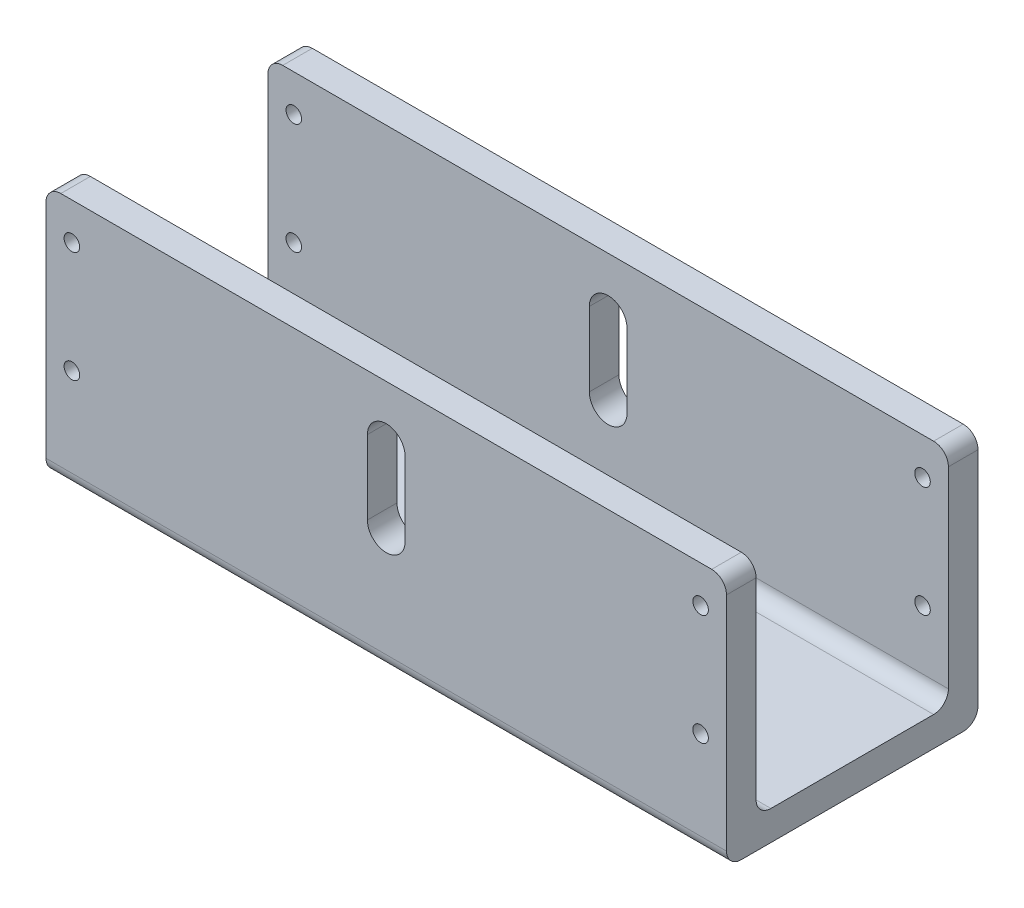
ISO-10303-21;
HEADER;
FILE_DESCRIPTION(('STEP AP214'),'2;1');
FILE_NAME('part.step','',(''),(''),'','','');
FILE_SCHEMA(('AUTOMOTIVE_DESIGN { 1 0 10303 214 1 1 1 1 }'));
ENDSEC;
DATA;
#1=APPLICATION_CONTEXT('core data for automotive mechanical design processes');
#2=APPLICATION_PROTOCOL_DEFINITION('international standard','automotive_design',2000,#1);
#3=PRODUCT_CONTEXT('',#1,'mechanical');
#4=PRODUCT('Part','Part','',(#3));
#5=PRODUCT_RELATED_PRODUCT_CATEGORY('part','',(#4));
#6=PRODUCT_DEFINITION_FORMATION('','',#4);
#7=PRODUCT_DEFINITION_CONTEXT('part definition',#1,'design');
#8=PRODUCT_DEFINITION('design','',#6,#7);
#9=PRODUCT_DEFINITION_SHAPE('','',#8);
#10=(LENGTH_UNIT() NAMED_UNIT(*) SI_UNIT(.MILLI.,.METRE.));
#11=(NAMED_UNIT(*) PLANE_ANGLE_UNIT() SI_UNIT($,.RADIAN.));
#12=(NAMED_UNIT(*) SI_UNIT($,.STERADIAN.) SOLID_ANGLE_UNIT());
#13=UNCERTAINTY_MEASURE_WITH_UNIT(LENGTH_MEASURE(1.E-05),#10,'distance_accuracy_value','');
#14=(GEOMETRIC_REPRESENTATION_CONTEXT(3) GLOBAL_UNCERTAINTY_ASSIGNED_CONTEXT((#13)) GLOBAL_UNIT_ASSIGNED_CONTEXT((#10,
#11,#12)) REPRESENTATION_CONTEXT('',''));
#15=CARTESIAN_POINT('',(0.,0.,0.));
#16=DIRECTION('',(0.,0.,1.));
#17=DIRECTION('',(1.,0.,0.));
#18=AXIS2_PLACEMENT_3D('',#15,#16,#17);
#19=CARTESIAN_POINT('',(0.,0.,4.));
#20=DIRECTION('',(0.,0.,1.));
#21=DIRECTION('',(1.,0.,0.));
#22=AXIS2_PLACEMENT_3D('',#19,#20,#21);
#23=PLANE('',#22);
#24=CARTESIAN_POINT('',(88.5,-5.,4.));
#25=DIRECTION('',(0.,0.,1.));
#26=DIRECTION('',(1.,0.,0.));
#27=AXIS2_PLACEMENT_3D('',#24,#25,#26);
#28=CIRCLE('',#27,1.05);
#29=CARTESIAN_POINT('',(89.55,-5.,4.));
#30=VERTEX_POINT('',#29);
#31=EDGE_CURVE('E357',#30,#30,#28,.T.);
#32=ORIENTED_EDGE('',*,*,#31,.F.);
#33=EDGE_LOOP('',(#32));
#34=FACE_BOUND('',#33,.T.);
#35=CARTESIAN_POINT('',(3.5,-5.,4.));
#36=DIRECTION('',(0.,0.,1.));
#37=DIRECTION('',(1.,0.,0.));
#38=AXIS2_PLACEMENT_3D('',#35,#36,#37);
#39=CIRCLE('',#38,1.05);
#40=CARTESIAN_POINT('',(4.55,-5.,4.));
#41=VERTEX_POINT('',#40);
#42=EDGE_CURVE('E375',#41,#41,#39,.T.);
#43=ORIENTED_EDGE('',*,*,#42,.F.);
#44=EDGE_LOOP('',(#43));
#45=FACE_BOUND('',#44,.T.);
#46=DIRECTION('',(0.,-1.,0.));
#47=VECTOR('',#46,1.);
#48=CARTESIAN_POINT('',(0.,0.,4.));
#49=LINE('',#48,#47);
#50=CARTESIAN_POINT('',(0.,-2.,4.));
#51=VERTEX_POINT('',#50);
#52=CARTESIAN_POINT('',(0.,-28.,4.));
#53=VERTEX_POINT('',#52);
#54=EDGE_CURVE('E376',#51,#53,#49,.T.);
#55=ORIENTED_EDGE('',*,*,#54,.T.);
#56=DIRECTION('',(1.,0.,0.));
#57=VECTOR('',#56,1.);
#58=CARTESIAN_POINT('',(92.,-28.,4.));
#59=LINE('',#58,#57);
#60=CARTESIAN_POINT('',(92.,-28.,4.));
#61=VERTEX_POINT('',#60);
#62=EDGE_CURVE('E468',#53,#61,#59,.T.);
#63=ORIENTED_EDGE('',*,*,#62,.T.);
#64=DIRECTION('',(0.,1.,0.));
#65=VECTOR('',#64,1.);
#66=CARTESIAN_POINT('',(92.,0.,4.));
#67=LINE('',#66,#65);
#68=CARTESIAN_POINT('',(92.,-2.,4.));
#69=VERTEX_POINT('',#68);
#70=EDGE_CURVE('E384',#61,#69,#67,.T.);
#71=ORIENTED_EDGE('',*,*,#70,.T.);
#72=CARTESIAN_POINT('',(90.,-2.,4.));
#73=DIRECTION('',(0.,0.,1.));
#74=DIRECTION('',(1.,0.,0.));
#75=AXIS2_PLACEMENT_3D('',#72,#73,#74);
#76=CIRCLE('',#75,2.);
#77=CARTESIAN_POINT('',(90.,0.,4.));
#78=VERTEX_POINT('',#77);
#79=EDGE_CURVE('E464',#69,#78,#76,.T.);
#80=ORIENTED_EDGE('',*,*,#79,.T.);
#81=DIRECTION('',(-1.,0.,0.));
#82=VECTOR('',#81,1.);
#83=CARTESIAN_POINT('',(0.,0.,4.));
#84=LINE('',#83,#82);
#85=CARTESIAN_POINT('',(2.,0.,4.));
#86=VERTEX_POINT('',#85);
#87=EDGE_CURVE('E388',#78,#86,#84,.T.);
#88=ORIENTED_EDGE('',*,*,#87,.T.);
#89=CARTESIAN_POINT('',(2.,-2.,4.));
#90=DIRECTION('',(0.,0.,1.));
#91=DIRECTION('',(1.,0.,0.));
#92=AXIS2_PLACEMENT_3D('',#89,#90,#91);
#93=CIRCLE('',#92,2.);
#94=EDGE_CURVE('E465',#86,#51,#93,.T.);
#95=ORIENTED_EDGE('',*,*,#94,.T.);
#96=EDGE_LOOP('',(#55,#63,#71,#80,#88,#95));
#97=FACE_BOUND('',#96,.T.);
#98=CARTESIAN_POINT('',(3.5,-20.,4.));
#99=DIRECTION('',(0.,0.,1.));
#100=DIRECTION('',(1.,0.,0.));
#101=AXIS2_PLACEMENT_3D('',#98,#99,#100);
#102=CIRCLE('',#101,1.05);
#103=CARTESIAN_POINT('',(4.55,-20.,4.));
#104=VERTEX_POINT('',#103);
#105=EDGE_CURVE('E363',#104,#104,#102,.T.);
#106=ORIENTED_EDGE('',*,*,#105,.F.);
#107=EDGE_LOOP('',(#106));
#108=FACE_BOUND('',#107,.T.);
#109=CARTESIAN_POINT('',(88.5,-20.,4.));
#110=DIRECTION('',(0.,0.,1.));
#111=DIRECTION('',(1.,0.,0.));
#112=AXIS2_PLACEMENT_3D('',#109,#110,#111);
#113=CIRCLE('',#112,1.04999999999999);
#114=CARTESIAN_POINT('',(89.55,-20.,4.));
#115=VERTEX_POINT('',#114);
#116=EDGE_CURVE('E348',#115,#115,#113,.T.);
#117=ORIENTED_EDGE('',*,*,#116,.F.);
#118=EDGE_LOOP('',(#117));
#119=FACE_BOUND('',#118,.T.);
#120=DIRECTION('',(0.,1.,0.));
#121=VECTOR('',#120,1.);
#122=CARTESIAN_POINT('',(48.55,-17.5,4.));
#123=LINE('',#122,#121);
#124=CARTESIAN_POINT('',(48.55,-17.5,4.));
#125=VERTEX_POINT('',#124);
#126=CARTESIAN_POINT('',(48.55,-7.5,4.));
#127=VERTEX_POINT('',#126);
#128=EDGE_CURVE('E306',#125,#127,#123,.T.);
#129=ORIENTED_EDGE('',*,*,#128,.F.);
#130=CARTESIAN_POINT('',(46.,-17.5,4.));
#131=DIRECTION('',(0.,0.,1.));
#132=DIRECTION('',(1.,0.,0.));
#133=AXIS2_PLACEMENT_3D('',#130,#131,#132);
#134=CIRCLE('',#133,2.55);
#135=CARTESIAN_POINT('',(43.45,-17.5,4.));
#136=VERTEX_POINT('',#135);
#137=EDGE_CURVE('E301',#136,#125,#134,.T.);
#138=ORIENTED_EDGE('',*,*,#137,.F.);
#139=DIRECTION('',(0.,-1.,0.));
#140=VECTOR('',#139,1.);
#141=CARTESIAN_POINT('',(43.45,-17.5,4.));
#142=LINE('',#141,#140);
#143=CARTESIAN_POINT('',(43.45,-7.5,4.));
#144=VERTEX_POINT('',#143);
#145=EDGE_CURVE('E316',#144,#136,#142,.T.);
#146=ORIENTED_EDGE('',*,*,#145,.F.);
#147=CARTESIAN_POINT('',(46.,-7.5,4.));
#148=DIRECTION('',(0.,0.,1.));
#149=DIRECTION('',(1.,0.,0.));
#150=AXIS2_PLACEMENT_3D('',#147,#148,#149);
#151=CIRCLE('',#150,2.55);
#152=EDGE_CURVE('E315',#127,#144,#151,.T.);
#153=ORIENTED_EDGE('',*,*,#152,.F.);
#154=EDGE_LOOP('',(#129,#138,#146,#153));
#155=FACE_BOUND('',#154,.T.);
#156=ADVANCED_FACE('F44',(#34,#45,#97,#108,#119,#155),#23,.T.);
#157=CARTESIAN_POINT('',(0.,0.,0.));
#158=DIRECTION('',(0.,0.,1.));
#159=DIRECTION('',(1.,0.,0.));
#160=AXIS2_PLACEMENT_3D('',#157,#158,#159);
#161=PLANE('',#160);
#162=CARTESIAN_POINT('',(88.5,-20.,0.));
#163=DIRECTION('',(0.,0.,1.));
#164=DIRECTION('',(1.,0.,0.));
#165=AXIS2_PLACEMENT_3D('',#162,#163,#164);
#166=CIRCLE('',#165,1.04999999999999);
#167=CARTESIAN_POINT('',(89.55,-20.,0.));
#168=VERTEX_POINT('',#167);
#169=EDGE_CURVE('E350',#168,#168,#166,.T.);
#170=ORIENTED_EDGE('',*,*,#169,.T.);
#171=EDGE_LOOP('',(#170));
#172=FACE_BOUND('',#171,.T.);
#173=CARTESIAN_POINT('',(88.5,-5.,0.));
#174=DIRECTION('',(0.,0.,1.));
#175=DIRECTION('',(1.,0.,0.));
#176=AXIS2_PLACEMENT_3D('',#173,#174,#175);
#177=CIRCLE('',#176,1.05);
#178=CARTESIAN_POINT('',(89.55,-5.,0.));
#179=VERTEX_POINT('',#178);
#180=EDGE_CURVE('E355',#179,#179,#177,.T.);
#181=ORIENTED_EDGE('',*,*,#180,.T.);
#182=EDGE_LOOP('',(#181));
#183=FACE_BOUND('',#182,.T.);
#184=CARTESIAN_POINT('',(3.5,-20.,0.));
#185=DIRECTION('',(0.,0.,1.));
#186=DIRECTION('',(1.,0.,0.));
#187=AXIS2_PLACEMENT_3D('',#184,#185,#186);
#188=CIRCLE('',#187,1.05);
#189=CARTESIAN_POINT('',(4.55,-20.,0.));
#190=VERTEX_POINT('',#189);
#191=EDGE_CURVE('E358',#190,#190,#188,.T.);
#192=ORIENTED_EDGE('',*,*,#191,.T.);
#193=EDGE_LOOP('',(#192));
#194=FACE_BOUND('',#193,.T.);
#195=CARTESIAN_POINT('',(3.5,-5.,0.));
#196=DIRECTION('',(0.,0.,1.));
#197=DIRECTION('',(1.,0.,0.));
#198=AXIS2_PLACEMENT_3D('',#195,#196,#197);
#199=CIRCLE('',#198,1.05);
#200=CARTESIAN_POINT('',(4.55,-5.,0.));
#201=VERTEX_POINT('',#200);
#202=EDGE_CURVE('E368',#201,#201,#199,.T.);
#203=ORIENTED_EDGE('',*,*,#202,.T.);
#204=EDGE_LOOP('',(#203));
#205=FACE_BOUND('',#204,.T.);
#206=DIRECTION('',(-1.,0.,0.));
#207=VECTOR('',#206,1.);
#208=CARTESIAN_POINT('',(0.,0.,0.));
#209=LINE('',#208,#207);
#210=CARTESIAN_POINT('',(90.,0.,0.));
#211=VERTEX_POINT('',#210);
#212=CARTESIAN_POINT('',(2.,0.,0.));
#213=VERTEX_POINT('',#212);
#214=EDGE_CURVE('E383',#211,#213,#209,.T.);
#215=ORIENTED_EDGE('',*,*,#214,.F.);
#216=CARTESIAN_POINT('',(90.,-2.,0.));
#217=DIRECTION('',(0.,0.,1.));
#218=DIRECTION('',(1.,0.,0.));
#219=AXIS2_PLACEMENT_3D('',#216,#217,#218);
#220=CIRCLE('',#219,2.);
#221=CARTESIAN_POINT('',(92.,-2.,0.));
#222=VERTEX_POINT('',#221);
#223=EDGE_CURVE('E495',#211,#222,#220,.F.);
#224=ORIENTED_EDGE('',*,*,#223,.T.);
#225=DIRECTION('',(0.,1.,0.));
#226=VECTOR('',#225,1.);
#227=CARTESIAN_POINT('',(92.,0.,0.));
#228=LINE('',#227,#226);
#229=CARTESIAN_POINT('',(92.,-32.,0.));
#230=VERTEX_POINT('',#229);
#231=EDGE_CURVE('E400',#230,#222,#228,.T.);
#232=ORIENTED_EDGE('',*,*,#231,.F.);
#233=DIRECTION('',(1.,0.,0.));
#234=VECTOR('',#233,1.);
#235=CARTESIAN_POINT('',(0.,-32.,0.));
#236=LINE('',#235,#234);
#237=CARTESIAN_POINT('',(0.,-32.,0.));
#238=VERTEX_POINT('',#237);
#239=EDGE_CURVE('E488',#230,#238,#236,.F.);
#240=ORIENTED_EDGE('',*,*,#239,.T.);
#241=DIRECTION('',(0.,-1.,0.));
#242=VECTOR('',#241,1.);
#243=CARTESIAN_POINT('',(0.,0.,0.));
#244=LINE('',#243,#242);
#245=CARTESIAN_POINT('',(0.,-2.,0.));
#246=VERTEX_POINT('',#245);
#247=EDGE_CURVE('E377',#246,#238,#244,.T.);
#248=ORIENTED_EDGE('',*,*,#247,.F.);
#249=CARTESIAN_POINT('',(2.,-2.,0.));
#250=DIRECTION('',(0.,0.,1.));
#251=DIRECTION('',(1.,0.,0.));
#252=AXIS2_PLACEMENT_3D('',#249,#250,#251);
#253=CIRCLE('',#252,2.);
#254=EDGE_CURVE('E489',#246,#213,#253,.F.);
#255=ORIENTED_EDGE('',*,*,#254,.T.);
#256=EDGE_LOOP('',(#215,#224,#232,#240,#248,#255));
#257=FACE_BOUND('',#256,.T.);
#258=CARTESIAN_POINT('',(46.,-17.5,0.));
#259=DIRECTION('',(0.,0.,1.));
#260=DIRECTION('',(1.,0.,0.));
#261=AXIS2_PLACEMENT_3D('',#258,#259,#260);
#262=CIRCLE('',#261,2.55);
#263=CARTESIAN_POINT('',(43.45,-17.5,0.));
#264=VERTEX_POINT('',#263);
#265=CARTESIAN_POINT('',(48.55,-17.5,0.));
#266=VERTEX_POINT('',#265);
#267=EDGE_CURVE('E296',#264,#266,#262,.T.);
#268=ORIENTED_EDGE('',*,*,#267,.T.);
#269=DIRECTION('',(0.,1.,0.));
#270=VECTOR('',#269,1.);
#271=CARTESIAN_POINT('',(48.55,-17.5,0.));
#272=LINE('',#271,#270);
#273=CARTESIAN_POINT('',(48.55,-7.5,0.));
#274=VERTEX_POINT('',#273);
#275=EDGE_CURVE('E321',#266,#274,#272,.T.);
#276=ORIENTED_EDGE('',*,*,#275,.T.);
#277=CARTESIAN_POINT('',(46.,-7.5,0.));
#278=DIRECTION('',(0.,0.,1.));
#279=DIRECTION('',(1.,0.,0.));
#280=AXIS2_PLACEMENT_3D('',#277,#278,#279);
#281=CIRCLE('',#280,2.55);
#282=CARTESIAN_POINT('',(43.45,-7.5,0.));
#283=VERTEX_POINT('',#282);
#284=EDGE_CURVE('E330',#274,#283,#281,.T.);
#285=ORIENTED_EDGE('',*,*,#284,.T.);
#286=DIRECTION('',(0.,-1.,0.));
#287=VECTOR('',#286,1.);
#288=CARTESIAN_POINT('',(43.45,-17.5,0.));
#289=LINE('',#288,#287);
#290=EDGE_CURVE('E309',#283,#264,#289,.T.);
#291=ORIENTED_EDGE('',*,*,#290,.T.);
#292=EDGE_LOOP('',(#268,#276,#285,#291));
#293=FACE_BOUND('',#292,.T.);
#294=ADVANCED_FACE('F599',(#172,#183,#194,#205,#257,#293),#161,.F.);
#295=CARTESIAN_POINT('',(0.,0.,4.));
#296=DIRECTION('',(1.,0.,0.));
#297=DIRECTION('',(0.,1.,0.));
#298=AXIS2_PLACEMENT_3D('',#295,#296,#297);
#299=PLANE('',#298);
#300=DIRECTION('',(0.,0.,-1.));
#301=VECTOR('',#300,1.);
#302=CARTESIAN_POINT('',(0.,-34.,0.));
#303=LINE('',#302,#301);
#304=CARTESIAN_POINT('',(0.,-34.,32.));
#305=VERTEX_POINT('',#304);
#306=CARTESIAN_POINT('',(0.,-34.,2.));
#307=VERTEX_POINT('',#306);
#308=EDGE_CURVE('E288',#305,#307,#303,.T.);
#309=ORIENTED_EDGE('',*,*,#308,.F.);
#310=CARTESIAN_POINT('',(0.,-32.,32.));
#311=DIRECTION('',(1.,0.,0.));
#312=DIRECTION('',(0.,1.,0.));
#313=AXIS2_PLACEMENT_3D('',#310,#311,#312);
#314=CIRCLE('',#313,2.);
#315=CARTESIAN_POINT('',(0.,-32.,34.));
#316=VERTEX_POINT('',#315);
#317=EDGE_CURVE('E443',#305,#316,#314,.F.);
#318=ORIENTED_EDGE('',*,*,#317,.T.);
#319=DIRECTION('',(0.,-1.,0.));
#320=VECTOR('',#319,1.);
#321=CARTESIAN_POINT('',(0.,-34.,34.));
#322=LINE('',#321,#320);
#323=CARTESIAN_POINT('',(0.,-2.,34.));
#324=VERTEX_POINT('',#323);
#325=EDGE_CURVE('E262',#324,#316,#322,.T.);
#326=ORIENTED_EDGE('',*,*,#325,.F.);
#327=DIRECTION('',(0.,0.,-1.));
#328=VECTOR('',#327,1.);
#329=CARTESIAN_POINT('',(0.,-2.,4.));
#330=LINE('',#329,#328);
#331=CARTESIAN_POINT('',(0.,-2.,30.));
#332=VERTEX_POINT('',#331);
#333=EDGE_CURVE('E438',#324,#332,#330,.T.);
#334=ORIENTED_EDGE('',*,*,#333,.T.);
#335=DIRECTION('',(0.,-1.,0.));
#336=VECTOR('',#335,1.);
#337=CARTESIAN_POINT('',(0.,-34.,30.));
#338=LINE('',#337,#336);
#339=CARTESIAN_POINT('',(0.,-28.,30.));
#340=VERTEX_POINT('',#339);
#341=EDGE_CURVE('E263',#332,#340,#338,.T.);
#342=ORIENTED_EDGE('',*,*,#341,.T.);
#343=CARTESIAN_POINT('',(0.,-28.,28.));
#344=DIRECTION('',(1.,0.,0.));
#345=DIRECTION('',(0.,1.,0.));
#346=AXIS2_PLACEMENT_3D('',#343,#344,#345);
#347=CIRCLE('',#346,2.);
#348=CARTESIAN_POINT('',(0.,-30.,28.));
#349=VERTEX_POINT('',#348);
#350=EDGE_CURVE('E494',#340,#349,#347,.T.);
#351=ORIENTED_EDGE('',*,*,#350,.T.);
#352=DIRECTION('',(0.,0.,-1.));
#353=VECTOR('',#352,1.);
#354=CARTESIAN_POINT('',(0.,-30.,0.));
#355=LINE('',#354,#353);
#356=CARTESIAN_POINT('',(0.,-30.,6.));
#357=VERTEX_POINT('',#356);
#358=EDGE_CURVE('E277',#349,#357,#355,.T.);
#359=ORIENTED_EDGE('',*,*,#358,.T.);
#360=CARTESIAN_POINT('',(0.,-28.,6.));
#361=DIRECTION('',(1.,0.,0.));
#362=DIRECTION('',(0.,1.,0.));
#363=AXIS2_PLACEMENT_3D('',#360,#361,#362);
#364=CIRCLE('',#363,2.);
#365=EDGE_CURVE('E503',#357,#53,#364,.T.);
#366=ORIENTED_EDGE('',*,*,#365,.T.);
#367=ORIENTED_EDGE('',*,*,#54,.F.);
#368=DIRECTION('',(0.,0.,-1.));
#369=VECTOR('',#368,1.);
#370=CARTESIAN_POINT('',(0.,-2.,4.));
#371=LINE('',#370,#369);
#372=EDGE_CURVE('E433',#51,#246,#371,.T.);
#373=ORIENTED_EDGE('',*,*,#372,.T.);
#374=ORIENTED_EDGE('',*,*,#247,.T.);
#375=CARTESIAN_POINT('',(0.,-32.,2.));
#376=DIRECTION('',(1.,0.,0.));
#377=DIRECTION('',(0.,1.,0.));
#378=AXIS2_PLACEMENT_3D('',#375,#376,#377);
#379=CIRCLE('',#378,2.);
#380=EDGE_CURVE('E435',#238,#307,#379,.F.);
#381=ORIENTED_EDGE('',*,*,#380,.T.);
#382=EDGE_LOOP('',(#309,#318,#326,#334,#342,#351,#359,#366,#367,#373,#374,#381));
#383=FACE_BOUND('',#382,.T.);
#384=ADVANCED_FACE('F560',(#383),#299,.F.);
#385=CARTESIAN_POINT('',(92.,0.,4.));
#386=DIRECTION('',(-1.,0.,0.));
#387=DIRECTION('',(0.,0.,1.));
#388=AXIS2_PLACEMENT_3D('',#385,#386,#387);
#389=PLANE('',#388);
#390=DIRECTION('',(0.,1.,0.));
#391=VECTOR('',#390,1.);
#392=CARTESIAN_POINT('',(92.,-34.,34.));
#393=LINE('',#392,#391);
#394=CARTESIAN_POINT('',(92.,-32.,34.));
#395=VERTEX_POINT('',#394);
#396=CARTESIAN_POINT('',(92.,-2.,34.));
#397=VERTEX_POINT('',#396);
#398=EDGE_CURVE('E267',#395,#397,#393,.T.);
#399=ORIENTED_EDGE('',*,*,#398,.F.);
#400=CARTESIAN_POINT('',(92.,-32.,32.));
#401=DIRECTION('',(-1.,0.,0.));
#402=DIRECTION('',(0.,0.,1.));
#403=AXIS2_PLACEMENT_3D('',#400,#401,#402);
#404=CIRCLE('',#403,2.);
#405=CARTESIAN_POINT('',(92.,-34.,32.));
#406=VERTEX_POINT('',#405);
#407=EDGE_CURVE('E425',#395,#406,#404,.F.);
#408=ORIENTED_EDGE('',*,*,#407,.T.);
#409=DIRECTION('',(0.,0.,1.));
#410=VECTOR('',#409,1.);
#411=CARTESIAN_POINT('',(92.,-34.,0.));
#412=LINE('',#411,#410);
#413=CARTESIAN_POINT('',(92.,-34.,2.));
#414=VERTEX_POINT('',#413);
#415=EDGE_CURVE('E293',#414,#406,#412,.T.);
#416=ORIENTED_EDGE('',*,*,#415,.F.);
#417=CARTESIAN_POINT('',(92.,-32.,2.));
#418=DIRECTION('',(-1.,0.,0.));
#419=DIRECTION('',(0.,0.,1.));
#420=AXIS2_PLACEMENT_3D('',#417,#418,#419);
#421=CIRCLE('',#420,2.);
#422=EDGE_CURVE('E411',#414,#230,#421,.F.);
#423=ORIENTED_EDGE('',*,*,#422,.T.);
#424=ORIENTED_EDGE('',*,*,#231,.T.);
#425=DIRECTION('',(0.,0.,-1.));
#426=VECTOR('',#425,1.);
#427=CARTESIAN_POINT('',(92.,-2.,4.));
#428=LINE('',#427,#426);
#429=EDGE_CURVE('E416',#222,#69,#428,.F.);
#430=ORIENTED_EDGE('',*,*,#429,.T.);
#431=ORIENTED_EDGE('',*,*,#70,.F.);
#432=CARTESIAN_POINT('',(92.,-28.,6.));
#433=DIRECTION('',(-1.,0.,0.));
#434=DIRECTION('',(0.,0.,1.));
#435=AXIS2_PLACEMENT_3D('',#432,#433,#434);
#436=CIRCLE('',#435,2.);
#437=CARTESIAN_POINT('',(92.,-30.,6.));
#438=VERTEX_POINT('',#437);
#439=EDGE_CURVE('E501',#61,#438,#436,.T.);
#440=ORIENTED_EDGE('',*,*,#439,.T.);
#441=DIRECTION('',(0.,0.,1.));
#442=VECTOR('',#441,1.);
#443=CARTESIAN_POINT('',(92.,-30.,0.));
#444=LINE('',#443,#442);
#445=CARTESIAN_POINT('',(92.,-30.,28.));
#446=VERTEX_POINT('',#445);
#447=EDGE_CURVE('E292',#438,#446,#444,.T.);
#448=ORIENTED_EDGE('',*,*,#447,.T.);
#449=CARTESIAN_POINT('',(92.,-28.,28.));
#450=DIRECTION('',(-1.,0.,0.));
#451=DIRECTION('',(0.,0.,1.));
#452=AXIS2_PLACEMENT_3D('',#449,#450,#451);
#453=CIRCLE('',#452,2.);
#454=CARTESIAN_POINT('',(92.,-28.,30.));
#455=VERTEX_POINT('',#454);
#456=EDGE_CURVE('E498',#446,#455,#453,.T.);
#457=ORIENTED_EDGE('',*,*,#456,.T.);
#458=DIRECTION('',(0.,1.,0.));
#459=VECTOR('',#458,1.);
#460=CARTESIAN_POINT('',(92.,-34.,30.));
#461=LINE('',#460,#459);
#462=CARTESIAN_POINT('',(92.,-2.,30.));
#463=VERTEX_POINT('',#462);
#464=EDGE_CURVE('E285',#455,#463,#461,.T.);
#465=ORIENTED_EDGE('',*,*,#464,.T.);
#466=DIRECTION('',(0.,0.,-1.));
#467=VECTOR('',#466,1.);
#468=CARTESIAN_POINT('',(92.,-2.,4.));
#469=LINE('',#468,#467);
#470=EDGE_CURVE('E417',#463,#397,#469,.F.);
#471=ORIENTED_EDGE('',*,*,#470,.T.);
#472=EDGE_LOOP('',(#399,#408,#416,#423,#424,#430,#431,#440,#448,#457,#465,#471));
#473=FACE_BOUND('',#472,.T.);
#474=ADVANCED_FACE('F601',(#473),#389,.F.);
#475=CARTESIAN_POINT('',(0.,0.,4.));
#476=DIRECTION('',(0.,-1.,0.));
#477=DIRECTION('',(0.,0.,-1.));
#478=AXIS2_PLACEMENT_3D('',#475,#476,#477);
#479=PLANE('',#478);
#480=ORIENTED_EDGE('',*,*,#87,.F.);
#481=DIRECTION('',(0.,0.,-1.));
#482=VECTOR('',#481,1.);
#483=CARTESIAN_POINT('',(90.,0.,4.));
#484=LINE('',#483,#482);
#485=EDGE_CURVE('E482',#78,#211,#484,.T.);
#486=ORIENTED_EDGE('',*,*,#485,.T.);
#487=ORIENTED_EDGE('',*,*,#214,.T.);
#488=DIRECTION('',(0.,0.,-1.));
#489=VECTOR('',#488,1.);
#490=CARTESIAN_POINT('',(2.,0.,4.));
#491=LINE('',#490,#489);
#492=EDGE_CURVE('E479',#213,#86,#491,.F.);
#493=ORIENTED_EDGE('',*,*,#492,.T.);
#494=EDGE_LOOP('',(#480,#486,#487,#493));
#495=FACE_BOUND('',#494,.T.);
#496=ADVANCED_FACE('F615',(#495),#479,.F.);
#497=CARTESIAN_POINT('',(3.5,-5.,4.));
#498=DIRECTION('',(0.,0.,-1.));
#499=DIRECTION('',(-1.,0.,0.));
#500=AXIS2_PLACEMENT_3D('',#497,#498,#499);
#501=CYLINDRICAL_SURFACE('',#500,1.05);
#502=ORIENTED_EDGE('',*,*,#42,.T.);
#503=EDGE_LOOP('',(#502));
#504=FACE_BOUND('',#503,.T.);
#505=ORIENTED_EDGE('',*,*,#202,.F.);
#506=EDGE_LOOP('',(#505));
#507=FACE_BOUND('',#506,.T.);
#508=ADVANCED_FACE('F613',(#504,#507),#501,.F.);
#509=CARTESIAN_POINT('',(3.5,-20.,4.));
#510=DIRECTION('',(0.,0.,-1.));
#511=DIRECTION('',(-1.,0.,0.));
#512=AXIS2_PLACEMENT_3D('',#509,#510,#511);
#513=CYLINDRICAL_SURFACE('',#512,1.05);
#514=ORIENTED_EDGE('',*,*,#105,.T.);
#515=EDGE_LOOP('',(#514));
#516=FACE_BOUND('',#515,.T.);
#517=ORIENTED_EDGE('',*,*,#191,.F.);
#518=EDGE_LOOP('',(#517));
#519=FACE_BOUND('',#518,.T.);
#520=ADVANCED_FACE('F623',(#516,#519),#513,.F.);
#521=CARTESIAN_POINT('',(88.5,-5.,4.));
#522=DIRECTION('',(0.,0.,-1.));
#523=DIRECTION('',(-1.,0.,0.));
#524=AXIS2_PLACEMENT_3D('',#521,#522,#523);
#525=CYLINDRICAL_SURFACE('',#524,1.05);
#526=ORIENTED_EDGE('',*,*,#31,.T.);
#527=EDGE_LOOP('',(#526));
#528=FACE_BOUND('',#527,.T.);
#529=ORIENTED_EDGE('',*,*,#180,.F.);
#530=EDGE_LOOP('',(#529));
#531=FACE_BOUND('',#530,.T.);
#532=ADVANCED_FACE('F639',(#528,#531),#525,.F.);
#533=CARTESIAN_POINT('',(88.5,-20.,4.));
#534=DIRECTION('',(0.,0.,-1.));
#535=DIRECTION('',(-1.,0.,0.));
#536=AXIS2_PLACEMENT_3D('',#533,#534,#535);
#537=CYLINDRICAL_SURFACE('',#536,1.04999999999999);
#538=ORIENTED_EDGE('',*,*,#116,.T.);
#539=EDGE_LOOP('',(#538));
#540=FACE_BOUND('',#539,.T.);
#541=ORIENTED_EDGE('',*,*,#169,.F.);
#542=EDGE_LOOP('',(#541));
#543=FACE_BOUND('',#542,.T.);
#544=ADVANCED_FACE('F643',(#540,#543),#537,.F.);
#545=CARTESIAN_POINT('',(46.,-17.5,4.));
#546=DIRECTION('',(0.,0.,-1.));
#547=DIRECTION('',(-1.,0.,0.));
#548=AXIS2_PLACEMENT_3D('',#545,#546,#547);
#549=CYLINDRICAL_SURFACE('',#548,2.55);
#550=ORIENTED_EDGE('',*,*,#267,.F.);
#551=DIRECTION('',(0.,0.,-1.));
#552=VECTOR('',#551,1.);
#553=CARTESIAN_POINT('',(43.45,-17.5,4.));
#554=LINE('',#553,#552);
#555=EDGE_CURVE('E317',#136,#264,#554,.T.);
#556=ORIENTED_EDGE('',*,*,#555,.F.);
#557=ORIENTED_EDGE('',*,*,#137,.T.);
#558=DIRECTION('',(0.,0.,-1.));
#559=VECTOR('',#558,1.);
#560=CARTESIAN_POINT('',(48.55,-17.5,4.));
#561=LINE('',#560,#559);
#562=EDGE_CURVE('E343',#125,#266,#561,.T.);
#563=ORIENTED_EDGE('',*,*,#562,.T.);
#564=EDGE_LOOP('',(#550,#556,#557,#563));
#565=FACE_BOUND('',#564,.T.);
#566=ADVANCED_FACE('F650',(#565),#549,.F.);
#567=CARTESIAN_POINT('',(48.55,-17.5,4.));
#568=DIRECTION('',(-1.,0.,0.));
#569=DIRECTION('',(0.,0.,1.));
#570=AXIS2_PLACEMENT_3D('',#567,#568,#569);
#571=PLANE('',#570);
#572=ORIENTED_EDGE('',*,*,#275,.F.);
#573=ORIENTED_EDGE('',*,*,#562,.F.);
#574=ORIENTED_EDGE('',*,*,#128,.T.);
#575=DIRECTION('',(0.,0.,-1.));
#576=VECTOR('',#575,1.);
#577=CARTESIAN_POINT('',(48.55,-7.5,4.));
#578=LINE('',#577,#576);
#579=EDGE_CURVE('E337',#127,#274,#578,.T.);
#580=ORIENTED_EDGE('',*,*,#579,.T.);
#581=EDGE_LOOP('',(#572,#573,#574,#580));
#582=FACE_BOUND('',#581,.T.);
#583=ADVANCED_FACE('F651',(#582),#571,.T.);
#584=CARTESIAN_POINT('',(46.,-7.5,4.));
#585=DIRECTION('',(0.,0.,-1.));
#586=DIRECTION('',(-1.,0.,0.));
#587=AXIS2_PLACEMENT_3D('',#584,#585,#586);
#588=CYLINDRICAL_SURFACE('',#587,2.55);
#589=ORIENTED_EDGE('',*,*,#284,.F.);
#590=ORIENTED_EDGE('',*,*,#579,.F.);
#591=ORIENTED_EDGE('',*,*,#152,.T.);
#592=DIRECTION('',(0.,0.,-1.));
#593=VECTOR('',#592,1.);
#594=CARTESIAN_POINT('',(43.45,-7.5,4.));
#595=LINE('',#594,#593);
#596=EDGE_CURVE('E340',#144,#283,#595,.T.);
#597=ORIENTED_EDGE('',*,*,#596,.T.);
#598=EDGE_LOOP('',(#589,#590,#591,#597));
#599=FACE_BOUND('',#598,.T.);
#600=ADVANCED_FACE('F654',(#599),#588,.F.);
#601=CARTESIAN_POINT('',(43.45,-17.5,4.));
#602=DIRECTION('',(1.,0.,0.));
#603=DIRECTION('',(0.,0.,-1.));
#604=AXIS2_PLACEMENT_3D('',#601,#602,#603);
#605=PLANE('',#604);
#606=ORIENTED_EDGE('',*,*,#290,.F.);
#607=ORIENTED_EDGE('',*,*,#596,.F.);
#608=ORIENTED_EDGE('',*,*,#145,.T.);
#609=ORIENTED_EDGE('',*,*,#555,.T.);
#610=EDGE_LOOP('',(#606,#607,#608,#609));
#611=FACE_BOUND('',#610,.T.);
#612=ADVANCED_FACE('F656',(#611),#605,.T.);
#613=CARTESIAN_POINT('',(0.,-30.,0.));
#614=DIRECTION('',(0.,1.,0.));
#615=DIRECTION('',(0.,0.,1.));
#616=AXIS2_PLACEMENT_3D('',#613,#614,#615);
#617=PLANE('',#616);
#618=CARTESIAN_POINT('',(46.,-30.,16.5));
#619=DIRECTION('',(0.,1.,0.));
#620=DIRECTION('',(0.,0.,1.));
#621=AXIS2_PLACEMENT_3D('',#618,#619,#620);
#622=CIRCLE('',#621,2.55);
#623=CARTESIAN_POINT('',(46.,-30.,19.05));
#624=VERTEX_POINT('',#623);
#625=EDGE_CURVE('E219',#624,#624,#622,.T.);
#626=ORIENTED_EDGE('',*,*,#625,.F.);
#627=EDGE_LOOP('',(#626));
#628=FACE_BOUND('',#627,.T.);
#629=ORIENTED_EDGE('',*,*,#358,.F.);
#630=DIRECTION('',(-1.,0.,0.));
#631=VECTOR('',#630,1.);
#632=CARTESIAN_POINT('',(92.,-30.,28.));
#633=LINE('',#632,#631);
#634=EDGE_CURVE('E459',#349,#446,#633,.F.);
#635=ORIENTED_EDGE('',*,*,#634,.T.);
#636=ORIENTED_EDGE('',*,*,#447,.F.);
#637=DIRECTION('',(1.,0.,0.));
#638=VECTOR('',#637,1.);
#639=CARTESIAN_POINT('',(0.,-30.,6.));
#640=LINE('',#639,#638);
#641=EDGE_CURVE('E457',#438,#357,#640,.F.);
#642=ORIENTED_EDGE('',*,*,#641,.T.);
#643=EDGE_LOOP('',(#629,#635,#636,#642));
#644=FACE_BOUND('',#643,.T.);
#645=ADVANCED_FACE('F548',(#628,#644),#617,.T.);
#646=CARTESIAN_POINT('',(0.,-34.,0.));
#647=DIRECTION('',(0.,1.,0.));
#648=DIRECTION('',(0.,0.,1.));
#649=AXIS2_PLACEMENT_3D('',#646,#647,#648);
#650=PLANE('',#649);
#651=CARTESIAN_POINT('',(46.,-34.,16.5));
#652=DIRECTION('',(0.,-1.,0.));
#653=DIRECTION('',(0.,0.,-1.));
#654=AXIS2_PLACEMENT_3D('',#651,#652,#653);
#655=CIRCLE('',#654,2.55);
#656=CARTESIAN_POINT('',(46.,-34.,13.95));
#657=VERTEX_POINT('',#656);
#658=EDGE_CURVE('E536',#657,#657,#655,.T.);
#659=ORIENTED_EDGE('',*,*,#658,.F.);
#660=EDGE_LOOP('',(#659));
#661=FACE_BOUND('',#660,.T.);
#662=ORIENTED_EDGE('',*,*,#415,.T.);
#663=DIRECTION('',(1.,0.,0.));
#664=VECTOR('',#663,1.);
#665=CARTESIAN_POINT('',(0.,-34.,32.));
#666=LINE('',#665,#664);
#667=EDGE_CURVE('E428',#406,#305,#666,.F.);
#668=ORIENTED_EDGE('',*,*,#667,.T.);
#669=ORIENTED_EDGE('',*,*,#308,.T.);
#670=DIRECTION('',(1.,0.,0.));
#671=VECTOR('',#670,1.);
#672=CARTESIAN_POINT('',(0.,-34.,2.));
#673=LINE('',#672,#671);
#674=EDGE_CURVE('E424',#307,#414,#673,.T.);
#675=ORIENTED_EDGE('',*,*,#674,.T.);
#676=EDGE_LOOP('',(#662,#668,#669,#675));
#677=FACE_BOUND('',#676,.T.);
#678=ADVANCED_FACE('F543',(#661,#677),#650,.F.);
#679=CARTESIAN_POINT('',(0.,0.,34.));
#680=DIRECTION('',(0.,0.,-1.));
#681=DIRECTION('',(-1.,0.,0.));
#682=AXIS2_PLACEMENT_3D('',#679,#680,#681);
#683=PLANE('',#682);
#684=DIRECTION('',(0.,-1.,0.));
#685=VECTOR('',#684,1.);
#686=CARTESIAN_POINT('',(48.55,0.,34.));
#687=LINE('',#686,#685);
#688=CARTESIAN_POINT('',(48.55,-7.5,34.));
#689=VERTEX_POINT('',#688);
#690=CARTESIAN_POINT('',(48.55,-17.5,34.));
#691=VERTEX_POINT('',#690);
#692=EDGE_CURVE('E224',#689,#691,#687,.T.);
#693=ORIENTED_EDGE('',*,*,#692,.T.);
#694=CARTESIAN_POINT('',(46.,-17.5,34.));
#695=DIRECTION('',(0.,0.,-1.));
#696=DIRECTION('',(-1.,0.,0.));
#697=AXIS2_PLACEMENT_3D('',#694,#695,#696);
#698=CIRCLE('',#697,2.55);
#699=CARTESIAN_POINT('',(43.45,-17.5,34.));
#700=VERTEX_POINT('',#699);
#701=EDGE_CURVE('E214',#691,#700,#698,.T.);
#702=ORIENTED_EDGE('',*,*,#701,.T.);
#703=DIRECTION('',(0.,1.,0.));
#704=VECTOR('',#703,1.);
#705=CARTESIAN_POINT('',(43.45,0.,34.));
#706=LINE('',#705,#704);
#707=CARTESIAN_POINT('',(43.45,-7.5,34.));
#708=VERTEX_POINT('',#707);
#709=EDGE_CURVE('E202',#700,#708,#706,.T.);
#710=ORIENTED_EDGE('',*,*,#709,.T.);
#711=CARTESIAN_POINT('',(46.,-7.5,34.));
#712=DIRECTION('',(0.,0.,-1.));
#713=DIRECTION('',(-1.,0.,0.));
#714=AXIS2_PLACEMENT_3D('',#711,#712,#713);
#715=CIRCLE('',#714,2.55);
#716=EDGE_CURVE('E206',#708,#689,#715,.T.);
#717=ORIENTED_EDGE('',*,*,#716,.T.);
#718=EDGE_LOOP('',(#693,#702,#710,#717));
#719=FACE_BOUND('',#718,.T.);
#720=ORIENTED_EDGE('',*,*,#325,.T.);
#721=DIRECTION('',(1.,0.,0.));
#722=VECTOR('',#721,1.);
#723=CARTESIAN_POINT('',(0.,-32.,34.));
#724=LINE('',#723,#722);
#725=EDGE_CURVE('E410',#316,#395,#724,.T.);
#726=ORIENTED_EDGE('',*,*,#725,.T.);
#727=ORIENTED_EDGE('',*,*,#398,.T.);
#728=CARTESIAN_POINT('',(90.,-2.,34.));
#729=DIRECTION('',(0.,0.,-1.));
#730=DIRECTION('',(-1.,0.,0.));
#731=AXIS2_PLACEMENT_3D('',#728,#729,#730);
#732=CIRCLE('',#731,2.);
#733=CARTESIAN_POINT('',(90.,0.,34.));
#734=VERTEX_POINT('',#733);
#735=EDGE_CURVE('E393',#397,#734,#732,.F.);
#736=ORIENTED_EDGE('',*,*,#735,.T.);
#737=DIRECTION('',(-1.,0.,0.));
#738=VECTOR('',#737,1.);
#739=CARTESIAN_POINT('',(0.,0.,34.));
#740=LINE('',#739,#738);
#741=CARTESIAN_POINT('',(2.,0.,34.));
#742=VERTEX_POINT('',#741);
#743=EDGE_CURVE('E272',#734,#742,#740,.T.);
#744=ORIENTED_EDGE('',*,*,#743,.T.);
#745=CARTESIAN_POINT('',(2.,-2.,34.));
#746=DIRECTION('',(0.,0.,-1.));
#747=DIRECTION('',(-1.,0.,0.));
#748=AXIS2_PLACEMENT_3D('',#745,#746,#747);
#749=CIRCLE('',#748,2.);
#750=EDGE_CURVE('E408',#742,#324,#749,.F.);
#751=ORIENTED_EDGE('',*,*,#750,.T.);
#752=EDGE_LOOP('',(#720,#726,#727,#736,#744,#751));
#753=FACE_BOUND('',#752,.T.);
#754=CARTESIAN_POINT('',(3.5,-5.,34.));
#755=DIRECTION('',(0.,0.,1.));
#756=DIRECTION('',(1.,0.,0.));
#757=AXIS2_PLACEMENT_3D('',#754,#755,#756);
#758=CIRCLE('',#757,1.05);
#759=CARTESIAN_POINT('',(4.55,-5.,34.));
#760=VERTEX_POINT('',#759);
#761=EDGE_CURVE('E257',#760,#760,#758,.T.);
#762=ORIENTED_EDGE('',*,*,#761,.F.);
#763=EDGE_LOOP('',(#762));
#764=FACE_BOUND('',#763,.T.);
#765=CARTESIAN_POINT('',(3.5,-20.,34.));
#766=DIRECTION('',(0.,0.,1.));
#767=DIRECTION('',(1.,0.,0.));
#768=AXIS2_PLACEMENT_3D('',#765,#766,#767);
#769=CIRCLE('',#768,1.05);
#770=CARTESIAN_POINT('',(4.55,-20.,34.));
#771=VERTEX_POINT('',#770);
#772=EDGE_CURVE('E247',#771,#771,#769,.T.);
#773=ORIENTED_EDGE('',*,*,#772,.F.);
#774=EDGE_LOOP('',(#773));
#775=FACE_BOUND('',#774,.T.);
#776=CARTESIAN_POINT('',(88.5,-20.,34.));
#777=DIRECTION('',(0.,0.,1.));
#778=DIRECTION('',(1.,0.,0.));
#779=AXIS2_PLACEMENT_3D('',#776,#777,#778);
#780=CIRCLE('',#779,1.04999999999999);
#781=CARTESIAN_POINT('',(89.55,-20.,34.));
#782=VERTEX_POINT('',#781);
#783=EDGE_CURVE('E241',#782,#782,#780,.T.);
#784=ORIENTED_EDGE('',*,*,#783,.F.);
#785=EDGE_LOOP('',(#784));
#786=FACE_BOUND('',#785,.T.);
#787=CARTESIAN_POINT('',(88.5,-5.,34.));
#788=DIRECTION('',(0.,0.,1.));
#789=DIRECTION('',(1.,0.,0.));
#790=AXIS2_PLACEMENT_3D('',#787,#788,#789);
#791=CIRCLE('',#790,1.04999999999999);
#792=CARTESIAN_POINT('',(89.55,-5.,34.));
#793=VERTEX_POINT('',#792);
#794=EDGE_CURVE('E235',#793,#793,#791,.T.);
#795=ORIENTED_EDGE('',*,*,#794,.F.);
#796=EDGE_LOOP('',(#795));
#797=FACE_BOUND('',#796,.T.);
#798=ADVANCED_FACE('F221',(#719,#753,#764,#775,#786,#797),#683,.F.);
#799=CARTESIAN_POINT('',(0.,0.,30.));
#800=DIRECTION('',(0.,0.,-1.));
#801=DIRECTION('',(-1.,0.,0.));
#802=AXIS2_PLACEMENT_3D('',#799,#800,#801);
#803=PLANE('',#802);
#804=CARTESIAN_POINT('',(46.,-17.5,30.));
#805=DIRECTION('',(0.,0.,-1.));
#806=DIRECTION('',(-1.,0.,0.));
#807=AXIS2_PLACEMENT_3D('',#804,#805,#806);
#808=CIRCLE('',#807,2.55);
#809=CARTESIAN_POINT('',(48.55,-17.5,30.));
#810=VERTEX_POINT('',#809);
#811=CARTESIAN_POINT('',(43.45,-17.5,30.));
#812=VERTEX_POINT('',#811);
#813=EDGE_CURVE('E11',#810,#812,#808,.T.);
#814=ORIENTED_EDGE('',*,*,#813,.F.);
#815=DIRECTION('',(0.,-1.,0.));
#816=VECTOR('',#815,1.);
#817=CARTESIAN_POINT('',(48.55,0.,30.));
#818=LINE('',#817,#816);
#819=CARTESIAN_POINT('',(48.55,-7.5,30.));
#820=VERTEX_POINT('',#819);
#821=EDGE_CURVE('E53',#820,#810,#818,.T.);
#822=ORIENTED_EDGE('',*,*,#821,.F.);
#823=CARTESIAN_POINT('',(46.,-7.5,30.));
#824=DIRECTION('',(0.,0.,-1.));
#825=DIRECTION('',(-1.,0.,0.));
#826=AXIS2_PLACEMENT_3D('',#823,#824,#825);
#827=CIRCLE('',#826,2.55);
#828=CARTESIAN_POINT('',(43.45,-7.5,30.));
#829=VERTEX_POINT('',#828);
#830=EDGE_CURVE('E508',#829,#820,#827,.T.);
#831=ORIENTED_EDGE('',*,*,#830,.F.);
#832=DIRECTION('',(0.,1.,0.));
#833=VECTOR('',#832,1.);
#834=CARTESIAN_POINT('',(43.45,0.,30.));
#835=LINE('',#834,#833);
#836=EDGE_CURVE('E510',#812,#829,#835,.T.);
#837=ORIENTED_EDGE('',*,*,#836,.F.);
#838=EDGE_LOOP('',(#814,#822,#831,#837));
#839=FACE_BOUND('',#838,.T.);
#840=CARTESIAN_POINT('',(88.5,-20.,30.));
#841=DIRECTION('',(0.,0.,1.));
#842=DIRECTION('',(1.,0.,0.));
#843=AXIS2_PLACEMENT_3D('',#840,#841,#842);
#844=CIRCLE('',#843,1.04999999999999);
#845=CARTESIAN_POINT('',(89.55,-20.,30.));
#846=VERTEX_POINT('',#845);
#847=EDGE_CURVE('E238',#846,#846,#844,.T.);
#848=ORIENTED_EDGE('',*,*,#847,.T.);
#849=EDGE_LOOP('',(#848));
#850=FACE_BOUND('',#849,.T.);
#851=CARTESIAN_POINT('',(3.5,-5.,30.));
#852=DIRECTION('',(0.,0.,1.));
#853=DIRECTION('',(1.,0.,0.));
#854=AXIS2_PLACEMENT_3D('',#851,#852,#853);
#855=CIRCLE('',#854,1.05);
#856=CARTESIAN_POINT('',(4.55,-5.,30.));
#857=VERTEX_POINT('',#856);
#858=EDGE_CURVE('E253',#857,#857,#855,.T.);
#859=ORIENTED_EDGE('',*,*,#858,.T.);
#860=EDGE_LOOP('',(#859));
#861=FACE_BOUND('',#860,.T.);
#862=ORIENTED_EDGE('',*,*,#464,.F.);
#863=DIRECTION('',(-1.,0.,0.));
#864=VECTOR('',#863,1.);
#865=CARTESIAN_POINT('',(0.,-28.,30.));
#866=LINE('',#865,#864);
#867=EDGE_CURVE('E455',#455,#340,#866,.T.);
#868=ORIENTED_EDGE('',*,*,#867,.T.);
#869=ORIENTED_EDGE('',*,*,#341,.F.);
#870=CARTESIAN_POINT('',(2.,-2.,30.));
#871=DIRECTION('',(0.,0.,-1.));
#872=DIRECTION('',(-1.,0.,0.));
#873=AXIS2_PLACEMENT_3D('',#870,#871,#872);
#874=CIRCLE('',#873,2.);
#875=CARTESIAN_POINT('',(2.,0.,30.));
#876=VERTEX_POINT('',#875);
#877=EDGE_CURVE('E447',#332,#876,#874,.T.);
#878=ORIENTED_EDGE('',*,*,#877,.T.);
#879=DIRECTION('',(-1.,0.,0.));
#880=VECTOR('',#879,1.);
#881=CARTESIAN_POINT('',(0.,0.,30.));
#882=LINE('',#881,#880);
#883=CARTESIAN_POINT('',(90.,0.,30.));
#884=VERTEX_POINT('',#883);
#885=EDGE_CURVE('E269',#884,#876,#882,.T.);
#886=ORIENTED_EDGE('',*,*,#885,.F.);
#887=CARTESIAN_POINT('',(90.,-2.,30.));
#888=DIRECTION('',(0.,0.,-1.));
#889=DIRECTION('',(-1.,0.,0.));
#890=AXIS2_PLACEMENT_3D('',#887,#888,#889);
#891=CIRCLE('',#890,2.);
#892=EDGE_CURVE('E448',#884,#463,#891,.T.);
#893=ORIENTED_EDGE('',*,*,#892,.T.);
#894=EDGE_LOOP('',(#862,#868,#869,#878,#886,#893));
#895=FACE_BOUND('',#894,.T.);
#896=CARTESIAN_POINT('',(3.5,-20.,30.));
#897=DIRECTION('',(0.,0.,1.));
#898=DIRECTION('',(1.,0.,0.));
#899=AXIS2_PLACEMENT_3D('',#896,#897,#898);
#900=CIRCLE('',#899,1.05);
#901=CARTESIAN_POINT('',(4.55,-20.,30.));
#902=VERTEX_POINT('',#901);
#903=EDGE_CURVE('E244',#902,#902,#900,.T.);
#904=ORIENTED_EDGE('',*,*,#903,.T.);
#905=EDGE_LOOP('',(#904));
#906=FACE_BOUND('',#905,.T.);
#907=CARTESIAN_POINT('',(88.5,-5.,30.));
#908=DIRECTION('',(0.,0.,1.));
#909=DIRECTION('',(1.,0.,0.));
#910=AXIS2_PLACEMENT_3D('',#907,#908,#909);
#911=CIRCLE('',#910,1.04999999999999);
#912=CARTESIAN_POINT('',(89.55,-5.,30.));
#913=VERTEX_POINT('',#912);
#914=EDGE_CURVE('E230',#913,#913,#911,.T.);
#915=ORIENTED_EDGE('',*,*,#914,.T.);
#916=EDGE_LOOP('',(#915));
#917=FACE_BOUND('',#916,.T.);
#918=ADVANCED_FACE('F521',(#839,#850,#861,#895,#906,#917),#803,.T.);
#919=CARTESIAN_POINT('',(0.,0.,34.));
#920=DIRECTION('',(0.,-1.,0.));
#921=DIRECTION('',(0.,0.,-1.));
#922=AXIS2_PLACEMENT_3D('',#919,#920,#921);
#923=PLANE('',#922);
#924=ORIENTED_EDGE('',*,*,#885,.T.);
#925=DIRECTION('',(0.,0.,-1.));
#926=VECTOR('',#925,1.);
#927=CARTESIAN_POINT('',(2.,0.,34.));
#928=LINE('',#927,#926);
#929=EDGE_CURVE('E477',#876,#742,#928,.F.);
#930=ORIENTED_EDGE('',*,*,#929,.T.);
#931=ORIENTED_EDGE('',*,*,#743,.F.);
#932=DIRECTION('',(0.,0.,-1.));
#933=VECTOR('',#932,1.);
#934=CARTESIAN_POINT('',(90.,0.,34.));
#935=LINE('',#934,#933);
#936=EDGE_CURVE('E475',#734,#884,#935,.T.);
#937=ORIENTED_EDGE('',*,*,#936,.T.);
#938=EDGE_LOOP('',(#924,#930,#931,#937));
#939=FACE_BOUND('',#938,.T.);
#940=ADVANCED_FACE('F670',(#939),#923,.F.);
#941=CARTESIAN_POINT('',(3.5,-5.,34.));
#942=DIRECTION('',(0.,0.,-1.));
#943=DIRECTION('',(-1.,0.,0.));
#944=AXIS2_PLACEMENT_3D('',#941,#942,#943);
#945=CYLINDRICAL_SURFACE('',#944,1.05);
#946=ORIENTED_EDGE('',*,*,#761,.T.);
#947=EDGE_LOOP('',(#946));
#948=FACE_BOUND('',#947,.T.);
#949=ORIENTED_EDGE('',*,*,#858,.F.);
#950=EDGE_LOOP('',(#949));
#951=FACE_BOUND('',#950,.T.);
#952=ADVANCED_FACE('F667',(#948,#951),#945,.F.);
#953=CARTESIAN_POINT('',(3.5,-20.,34.));
#954=DIRECTION('',(0.,0.,-1.));
#955=DIRECTION('',(-1.,0.,0.));
#956=AXIS2_PLACEMENT_3D('',#953,#954,#955);
#957=CYLINDRICAL_SURFACE('',#956,1.05);
#958=ORIENTED_EDGE('',*,*,#772,.T.);
#959=EDGE_LOOP('',(#958));
#960=FACE_BOUND('',#959,.T.);
#961=ORIENTED_EDGE('',*,*,#903,.F.);
#962=EDGE_LOOP('',(#961));
#963=FACE_BOUND('',#962,.T.);
#964=ADVANCED_FACE('F680',(#960,#963),#957,.F.);
#965=CARTESIAN_POINT('',(88.5,-20.,34.));
#966=DIRECTION('',(0.,0.,-1.));
#967=DIRECTION('',(-1.,0.,0.));
#968=AXIS2_PLACEMENT_3D('',#965,#966,#967);
#969=CYLINDRICAL_SURFACE('',#968,1.04999999999999);
#970=ORIENTED_EDGE('',*,*,#783,.T.);
#971=EDGE_LOOP('',(#970));
#972=FACE_BOUND('',#971,.T.);
#973=ORIENTED_EDGE('',*,*,#847,.F.);
#974=EDGE_LOOP('',(#973));
#975=FACE_BOUND('',#974,.T.);
#976=ADVANCED_FACE('F682',(#972,#975),#969,.F.);
#977=CARTESIAN_POINT('',(88.5,-5.,34.));
#978=DIRECTION('',(0.,0.,-1.));
#979=DIRECTION('',(-1.,0.,0.));
#980=AXIS2_PLACEMENT_3D('',#977,#978,#979);
#981=CYLINDRICAL_SURFACE('',#980,1.04999999999999);
#982=ORIENTED_EDGE('',*,*,#794,.T.);
#983=EDGE_LOOP('',(#982));
#984=FACE_BOUND('',#983,.T.);
#985=ORIENTED_EDGE('',*,*,#914,.F.);
#986=EDGE_LOOP('',(#985));
#987=FACE_BOUND('',#986,.T.);
#988=ADVANCED_FACE('F683',(#984,#987),#981,.F.);
#989=CARTESIAN_POINT('',(0.,-32.,32.));
#990=DIRECTION('',(1.,0.,0.));
#991=DIRECTION('',(0.,0.,-1.));
#992=AXIS2_PLACEMENT_3D('',#989,#990,#991);
#993=CYLINDRICAL_SURFACE('',#992,2.);
#994=ORIENTED_EDGE('',*,*,#317,.F.);
#995=ORIENTED_EDGE('',*,*,#667,.F.);
#996=ORIENTED_EDGE('',*,*,#407,.F.);
#997=ORIENTED_EDGE('',*,*,#725,.F.);
#998=EDGE_LOOP('',(#994,#995,#996,#997));
#999=FACE_BOUND('',#998,.T.);
#1000=ADVANCED_FACE('F551',(#999),#993,.T.);
#1001=CARTESIAN_POINT('',(0.,-28.,28.));
#1002=DIRECTION('',(1.,0.,0.));
#1003=DIRECTION('',(0.,0.,-1.));
#1004=AXIS2_PLACEMENT_3D('',#1001,#1002,#1003);
#1005=CYLINDRICAL_SURFACE('',#1004,2.);
#1006=ORIENTED_EDGE('',*,*,#456,.F.);
#1007=ORIENTED_EDGE('',*,*,#634,.F.);
#1008=ORIENTED_EDGE('',*,*,#350,.F.);
#1009=ORIENTED_EDGE('',*,*,#867,.F.);
#1010=EDGE_LOOP('',(#1006,#1007,#1008,#1009));
#1011=FACE_BOUND('',#1010,.T.);
#1012=ADVANCED_FACE('F576',(#1011),#1005,.F.);
#1013=CARTESIAN_POINT('',(0.,-28.,6.));
#1014=DIRECTION('',(-1.,0.,0.));
#1015=DIRECTION('',(0.,0.,1.));
#1016=AXIS2_PLACEMENT_3D('',#1013,#1014,#1015);
#1017=CYLINDRICAL_SURFACE('',#1016,2.);
#1018=ORIENTED_EDGE('',*,*,#365,.F.);
#1019=ORIENTED_EDGE('',*,*,#641,.F.);
#1020=ORIENTED_EDGE('',*,*,#439,.F.);
#1021=ORIENTED_EDGE('',*,*,#62,.F.);
#1022=EDGE_LOOP('',(#1018,#1019,#1020,#1021));
#1023=FACE_BOUND('',#1022,.T.);
#1024=ADVANCED_FACE('F581',(#1023),#1017,.F.);
#1025=CARTESIAN_POINT('',(2.,-2.,4.));
#1026=DIRECTION('',(0.,0.,-1.));
#1027=DIRECTION('',(-1.,0.,0.));
#1028=AXIS2_PLACEMENT_3D('',#1025,#1026,#1027);
#1029=CYLINDRICAL_SURFACE('',#1028,2.);
#1030=ORIENTED_EDGE('',*,*,#750,.F.);
#1031=ORIENTED_EDGE('',*,*,#929,.F.);
#1032=ORIENTED_EDGE('',*,*,#877,.F.);
#1033=ORIENTED_EDGE('',*,*,#333,.F.);
#1034=EDGE_LOOP('',(#1030,#1031,#1032,#1033));
#1035=FACE_BOUND('',#1034,.T.);
#1036=ADVANCED_FACE('F570',(#1035),#1029,.T.);
#1037=CARTESIAN_POINT('',(90.,-2.,34.));
#1038=DIRECTION('',(0.,0.,-1.));
#1039=DIRECTION('',(-1.,0.,0.));
#1040=AXIS2_PLACEMENT_3D('',#1037,#1038,#1039);
#1041=CYLINDRICAL_SURFACE('',#1040,2.);
#1042=ORIENTED_EDGE('',*,*,#735,.F.);
#1043=ORIENTED_EDGE('',*,*,#470,.F.);
#1044=ORIENTED_EDGE('',*,*,#892,.F.);
#1045=ORIENTED_EDGE('',*,*,#936,.F.);
#1046=EDGE_LOOP('',(#1042,#1043,#1044,#1045));
#1047=FACE_BOUND('',#1046,.T.);
#1048=ADVANCED_FACE('F763',(#1047),#1041,.T.);
#1049=CARTESIAN_POINT('',(90.,-2.,4.));
#1050=DIRECTION('',(0.,0.,-1.));
#1051=DIRECTION('',(-1.,0.,0.));
#1052=AXIS2_PLACEMENT_3D('',#1049,#1050,#1051);
#1053=CYLINDRICAL_SURFACE('',#1052,2.);
#1054=ORIENTED_EDGE('',*,*,#79,.F.);
#1055=ORIENTED_EDGE('',*,*,#429,.F.);
#1056=ORIENTED_EDGE('',*,*,#223,.F.);
#1057=ORIENTED_EDGE('',*,*,#485,.F.);
#1058=EDGE_LOOP('',(#1054,#1055,#1056,#1057));
#1059=FACE_BOUND('',#1058,.T.);
#1060=ADVANCED_FACE('F609',(#1059),#1053,.T.);
#1061=CARTESIAN_POINT('',(2.,-2.,4.));
#1062=DIRECTION('',(0.,0.,-1.));
#1063=DIRECTION('',(-1.,0.,0.));
#1064=AXIS2_PLACEMENT_3D('',#1061,#1062,#1063);
#1065=CYLINDRICAL_SURFACE('',#1064,2.);
#1066=ORIENTED_EDGE('',*,*,#94,.F.);
#1067=ORIENTED_EDGE('',*,*,#492,.F.);
#1068=ORIENTED_EDGE('',*,*,#254,.F.);
#1069=ORIENTED_EDGE('',*,*,#372,.F.);
#1070=EDGE_LOOP('',(#1066,#1067,#1068,#1069));
#1071=FACE_BOUND('',#1070,.T.);
#1072=ADVANCED_FACE('F594',(#1071),#1065,.T.);
#1073=CARTESIAN_POINT('',(0.,-32.,2.));
#1074=DIRECTION('',(1.,0.,0.));
#1075=DIRECTION('',(0.,0.,-1.));
#1076=AXIS2_PLACEMENT_3D('',#1073,#1074,#1075);
#1077=CYLINDRICAL_SURFACE('',#1076,2.);
#1078=ORIENTED_EDGE('',*,*,#380,.F.);
#1079=ORIENTED_EDGE('',*,*,#239,.F.);
#1080=ORIENTED_EDGE('',*,*,#422,.F.);
#1081=ORIENTED_EDGE('',*,*,#674,.F.);
#1082=EDGE_LOOP('',(#1078,#1079,#1080,#1081));
#1083=FACE_BOUND('',#1082,.T.);
#1084=ADVANCED_FACE('F50',(#1083),#1077,.T.);
#1085=CARTESIAN_POINT('',(46.,-17.5,45.));
#1086=DIRECTION('',(0.,0.,-1.));
#1087=DIRECTION('',(-1.,0.,0.));
#1088=AXIS2_PLACEMENT_3D('',#1085,#1086,#1087);
#1089=CYLINDRICAL_SURFACE('',#1088,2.55);
#1090=DIRECTION('',(0.,0.,-1.));
#1091=VECTOR('',#1090,1.);
#1092=CARTESIAN_POINT('',(48.55,-17.5,45.));
#1093=LINE('',#1092,#1091);
#1094=EDGE_CURVE('E208',#691,#810,#1093,.T.);
#1095=ORIENTED_EDGE('',*,*,#1094,.T.);
#1096=ORIENTED_EDGE('',*,*,#813,.T.);
#1097=DIRECTION('',(0.,0.,-1.));
#1098=VECTOR('',#1097,1.);
#1099=CARTESIAN_POINT('',(43.45,-17.5,45.));
#1100=LINE('',#1099,#1098);
#1101=EDGE_CURVE('E66',#700,#812,#1100,.T.);
#1102=ORIENTED_EDGE('',*,*,#1101,.F.);
#1103=ORIENTED_EDGE('',*,*,#701,.F.);
#1104=EDGE_LOOP('',(#1095,#1096,#1102,#1103));
#1105=FACE_BOUND('',#1104,.T.);
#1106=ADVANCED_FACE('F213',(#1105),#1089,.F.);
#1107=CARTESIAN_POINT('',(48.55,-17.5,45.));
#1108=DIRECTION('',(1.,0.,0.));
#1109=DIRECTION('',(0.,0.,-1.));
#1110=AXIS2_PLACEMENT_3D('',#1107,#1108,#1109);
#1111=PLANE('',#1110);
#1112=DIRECTION('',(0.,0.,-1.));
#1113=VECTOR('',#1112,1.);
#1114=CARTESIAN_POINT('',(48.55,-7.5,45.));
#1115=LINE('',#1114,#1113);
#1116=EDGE_CURVE('E518',#689,#820,#1115,.T.);
#1117=ORIENTED_EDGE('',*,*,#1116,.T.);
#1118=ORIENTED_EDGE('',*,*,#821,.T.);
#1119=ORIENTED_EDGE('',*,*,#1094,.F.);
#1120=ORIENTED_EDGE('',*,*,#692,.F.);
#1121=EDGE_LOOP('',(#1117,#1118,#1119,#1120));
#1122=FACE_BOUND('',#1121,.T.);
#1123=ADVANCED_FACE('F516',(#1122),#1111,.F.);
#1124=CARTESIAN_POINT('',(46.,-7.5,45.));
#1125=DIRECTION('',(0.,0.,-1.));
#1126=DIRECTION('',(-1.,0.,0.));
#1127=AXIS2_PLACEMENT_3D('',#1124,#1125,#1126);
#1128=CYLINDRICAL_SURFACE('',#1127,2.55);
#1129=DIRECTION('',(0.,0.,-1.));
#1130=VECTOR('',#1129,1.);
#1131=CARTESIAN_POINT('',(43.45,-7.5,45.));
#1132=LINE('',#1131,#1130);
#1133=EDGE_CURVE('E61',#708,#829,#1132,.T.);
#1134=ORIENTED_EDGE('',*,*,#1133,.T.);
#1135=ORIENTED_EDGE('',*,*,#830,.T.);
#1136=ORIENTED_EDGE('',*,*,#1116,.F.);
#1137=ORIENTED_EDGE('',*,*,#716,.F.);
#1138=EDGE_LOOP('',(#1134,#1135,#1136,#1137));
#1139=FACE_BOUND('',#1138,.T.);
#1140=ADVANCED_FACE('F527',(#1139),#1128,.F.);
#1141=CARTESIAN_POINT('',(43.45,-17.5,45.));
#1142=DIRECTION('',(-1.,0.,0.));
#1143=DIRECTION('',(0.,0.,1.));
#1144=AXIS2_PLACEMENT_3D('',#1141,#1142,#1143);
#1145=PLANE('',#1144);
#1146=ORIENTED_EDGE('',*,*,#1101,.T.);
#1147=ORIENTED_EDGE('',*,*,#836,.T.);
#1148=ORIENTED_EDGE('',*,*,#1133,.F.);
#1149=ORIENTED_EDGE('',*,*,#709,.F.);
#1150=EDGE_LOOP('',(#1146,#1147,#1148,#1149));
#1151=FACE_BOUND('',#1150,.T.);
#1152=ADVANCED_FACE('F203',(#1151),#1145,.F.);
#1153=CARTESIAN_POINT('',(46.,-29.,16.5));
#1154=DIRECTION('',(0.,-1.,0.));
#1155=DIRECTION('',(0.,0.,-1.));
#1156=AXIS2_PLACEMENT_3D('',#1153,#1154,#1155);
#1157=CYLINDRICAL_SURFACE('',#1156,2.55);
#1158=ORIENTED_EDGE('',*,*,#625,.T.);
#1159=EDGE_LOOP('',(#1158));
#1160=FACE_BOUND('',#1159,.T.);
#1161=ORIENTED_EDGE('',*,*,#658,.T.);
#1162=EDGE_LOOP('',(#1161));
#1163=FACE_BOUND('',#1162,.T.);
#1164=ADVANCED_FACE('F541',(#1160,#1163),#1157,.F.);
#1165=CLOSED_SHELL('',(#156,#294,#384,#474,#496,#508,#520,#532,#544,#566,#583,#600,#612,#645,
#678,#798,#918,#940,#952,#964,#976,#988,#1000,#1012,#1024,#1036,#1048,#1060,#1072,#1084,#1106,
#1123,#1140,#1152,#1164));
#1166=MANIFOLD_SOLID_BREP('B2',#1165);
#1167=ADVANCED_BREP_SHAPE_REPRESENTATION('',(#18,#1166),#14);
#1168=SHAPE_DEFINITION_REPRESENTATION(#9,#1167);
ENDSEC;
END-ISO-10303-21;
